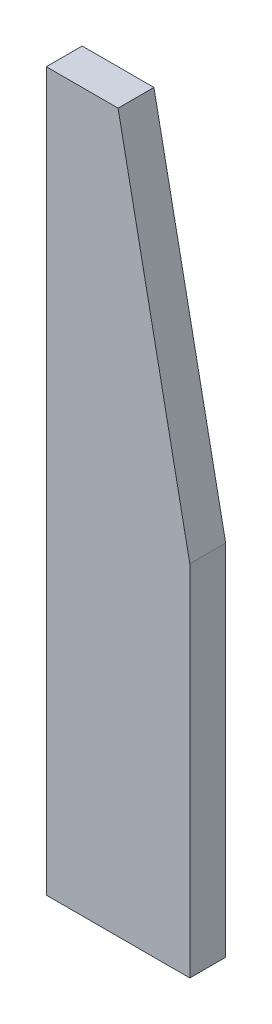
ISO-10303-21;
HEADER;
FILE_DESCRIPTION(('STEP AP214'),'2;1');
FILE_NAME('part.step','',(''),(''),'','','');
FILE_SCHEMA(('AUTOMOTIVE_DESIGN { 1 0 10303 214 1 1 1 1 }'));
ENDSEC;
DATA;
#1=APPLICATION_CONTEXT('core data for automotive mechanical design processes');
#2=APPLICATION_PROTOCOL_DEFINITION('international standard','automotive_design',2000,#1);
#3=PRODUCT_CONTEXT('',#1,'mechanical');
#4=PRODUCT('Part','Part','',(#3));
#5=PRODUCT_RELATED_PRODUCT_CATEGORY('part','',(#4));
#6=PRODUCT_DEFINITION_FORMATION('','',#4);
#7=PRODUCT_DEFINITION_CONTEXT('part definition',#1,'design');
#8=PRODUCT_DEFINITION('design','',#6,#7);
#9=PRODUCT_DEFINITION_SHAPE('','',#8);
#10=(LENGTH_UNIT() NAMED_UNIT(*) SI_UNIT(.MILLI.,.METRE.));
#11=(NAMED_UNIT(*) PLANE_ANGLE_UNIT() SI_UNIT($,.RADIAN.));
#12=(NAMED_UNIT(*) SI_UNIT($,.STERADIAN.) SOLID_ANGLE_UNIT());
#13=UNCERTAINTY_MEASURE_WITH_UNIT(LENGTH_MEASURE(1.E-05),#10,'distance_accuracy_value','');
#14=(GEOMETRIC_REPRESENTATION_CONTEXT(3) GLOBAL_UNCERTAINTY_ASSIGNED_CONTEXT((#13)) GLOBAL_UNIT_ASSIGNED_CONTEXT((#10,
#11,#12)) REPRESENTATION_CONTEXT('',''));
#15=CARTESIAN_POINT('',(0.,0.,0.));
#16=DIRECTION('',(0.,0.,1.));
#17=DIRECTION('',(1.,0.,0.));
#18=AXIS2_PLACEMENT_3D('',#15,#16,#17);
#19=CARTESIAN_POINT('',(25.4,-63.5,-3.175));
#20=DIRECTION('',(0.,0.,1.));
#21=DIRECTION('',(1.,0.,0.));
#22=AXIS2_PLACEMENT_3D('',#19,#20,#21);
#23=PLANE('',#22);
#24=DIRECTION('',(-1.,0.,0.));
#25=VECTOR('',#24,1.);
#26=CARTESIAN_POINT('',(25.4,63.5,-3.175));
#27=LINE('',#26,#25);
#28=CARTESIAN_POINT('',(12.7,63.5,-3.175));
#29=VERTEX_POINT('',#28);
#30=CARTESIAN_POINT('',(0.,63.5,-3.175));
#31=VERTEX_POINT('',#30);
#32=EDGE_CURVE('E11',#29,#31,#27,.T.);
#33=ORIENTED_EDGE('',*,*,#32,.F.);
#34=DIRECTION('',(0.196116135138184,-0.98058067569092,0.));
#35=VECTOR('',#34,1.);
#36=CARTESIAN_POINT('',(24.4230769230769,4.88461538461538,-3.175));
#37=LINE('',#36,#35);
#38=CARTESIAN_POINT('',(25.4,0.,-3.175));
#39=VERTEX_POINT('',#38);
#40=EDGE_CURVE('E143',#29,#39,#37,.T.);
#41=ORIENTED_EDGE('',*,*,#40,.T.);
#42=DIRECTION('',(0.,1.,0.));
#43=VECTOR('',#42,1.);
#44=CARTESIAN_POINT('',(25.4,-63.5,-3.175));
#45=LINE('',#44,#43);
#46=CARTESIAN_POINT('',(25.4,-63.5,-3.175));
#47=VERTEX_POINT('',#46);
#48=EDGE_CURVE('E100',#47,#39,#45,.T.);
#49=ORIENTED_EDGE('',*,*,#48,.F.);
#50=DIRECTION('',(-1.,0.,0.));
#51=VECTOR('',#50,1.);
#52=CARTESIAN_POINT('',(25.4,-63.5,-3.175));
#53=LINE('',#52,#51);
#54=CARTESIAN_POINT('',(0.,-63.5,-3.175));
#55=VERTEX_POINT('',#54);
#56=EDGE_CURVE('E93',#47,#55,#53,.T.);
#57=ORIENTED_EDGE('',*,*,#56,.T.);
#58=DIRECTION('',(0.,1.,0.));
#59=VECTOR('',#58,1.);
#60=CARTESIAN_POINT('',(0.,-63.5,-3.175));
#61=LINE('',#60,#59);
#62=EDGE_CURVE('E106',#55,#31,#61,.T.);
#63=ORIENTED_EDGE('',*,*,#62,.T.);
#64=EDGE_LOOP('',(#33,#41,#49,#57,#63));
#65=FACE_BOUND('',#64,.T.);
#66=ADVANCED_FACE('F44',(#65),#23,.F.);
#67=CARTESIAN_POINT('',(25.4,63.5,3.175));
#68=DIRECTION('',(0.,-1.,0.));
#69=DIRECTION('',(0.,0.,-1.));
#70=AXIS2_PLACEMENT_3D('',#67,#68,#69);
#71=PLANE('',#70);
#72=DIRECTION('',(-1.,0.,0.));
#73=VECTOR('',#72,1.);
#74=CARTESIAN_POINT('',(25.4,63.5,3.175));
#75=LINE('',#74,#73);
#76=CARTESIAN_POINT('',(12.7,63.5,3.175));
#77=VERTEX_POINT('',#76);
#78=CARTESIAN_POINT('',(0.,63.5,3.175));
#79=VERTEX_POINT('',#78);
#80=EDGE_CURVE('E54',#77,#79,#75,.T.);
#81=ORIENTED_EDGE('',*,*,#80,.F.);
#82=DIRECTION('',(0.,0.,1.));
#83=VECTOR('',#82,1.);
#84=CARTESIAN_POINT('',(12.7,63.5,-3.175));
#85=LINE('',#84,#83);
#86=EDGE_CURVE('E140',#29,#77,#85,.T.);
#87=ORIENTED_EDGE('',*,*,#86,.F.);
#88=ORIENTED_EDGE('',*,*,#32,.T.);
#89=DIRECTION('',(0.,0.,1.));
#90=VECTOR('',#89,1.);
#91=CARTESIAN_POINT('',(0.,63.5,3.175));
#92=LINE('',#91,#90);
#93=EDGE_CURVE('E112',#31,#79,#92,.T.);
#94=ORIENTED_EDGE('',*,*,#93,.T.);
#95=EDGE_LOOP('',(#81,#87,#88,#94));
#96=FACE_BOUND('',#95,.T.);
#97=ADVANCED_FACE('F138',(#96),#71,.F.);
#98=CARTESIAN_POINT('',(25.4,-63.5,3.175));
#99=DIRECTION('',(0.,0.,-1.));
#100=DIRECTION('',(-1.,0.,0.));
#101=AXIS2_PLACEMENT_3D('',#98,#99,#100);
#102=PLANE('',#101);
#103=DIRECTION('',(0.,-1.,0.));
#104=VECTOR('',#103,1.);
#105=CARTESIAN_POINT('',(25.4,-63.5,3.175));
#106=LINE('',#105,#104);
#107=CARTESIAN_POINT('',(25.4,0.,3.175));
#108=VERTEX_POINT('',#107);
#109=CARTESIAN_POINT('',(25.4,-63.5,3.175));
#110=VERTEX_POINT('',#109);
#111=EDGE_CURVE('E47',#108,#110,#106,.T.);
#112=ORIENTED_EDGE('',*,*,#111,.F.);
#113=DIRECTION('',(-0.196116135138184,0.98058067569092,0.));
#114=VECTOR('',#113,1.);
#115=CARTESIAN_POINT('',(37.6115384615385,-61.0576923076923,3.175));
#116=LINE('',#115,#114);
#117=EDGE_CURVE('E61',#108,#77,#116,.T.);
#118=ORIENTED_EDGE('',*,*,#117,.T.);
#119=ORIENTED_EDGE('',*,*,#80,.T.);
#120=DIRECTION('',(0.,-1.,0.));
#121=VECTOR('',#120,1.);
#122=CARTESIAN_POINT('',(0.,-63.5,3.175));
#123=LINE('',#122,#121);
#124=CARTESIAN_POINT('',(0.,-63.5,3.175));
#125=VERTEX_POINT('',#124);
#126=EDGE_CURVE('E101',#79,#125,#123,.T.);
#127=ORIENTED_EDGE('',*,*,#126,.T.);
#128=DIRECTION('',(-1.,0.,0.));
#129=VECTOR('',#128,1.);
#130=CARTESIAN_POINT('',(25.4,-63.5,3.175));
#131=LINE('',#130,#129);
#132=EDGE_CURVE('E96',#110,#125,#131,.T.);
#133=ORIENTED_EDGE('',*,*,#132,.F.);
#134=EDGE_LOOP('',(#112,#118,#119,#127,#133));
#135=FACE_BOUND('',#134,.T.);
#136=ADVANCED_FACE('F134',(#135),#102,.F.);
#137=CARTESIAN_POINT('',(25.4,-63.5,3.175));
#138=DIRECTION('',(0.,1.,0.));
#139=DIRECTION('',(0.,0.,1.));
#140=AXIS2_PLACEMENT_3D('',#137,#138,#139);
#141=PLANE('',#140);
#142=DIRECTION('',(0.,0.,-1.));
#143=VECTOR('',#142,1.);
#144=CARTESIAN_POINT('',(0.,-63.5,3.175));
#145=LINE('',#144,#143);
#146=EDGE_CURVE('E90',#125,#55,#145,.T.);
#147=ORIENTED_EDGE('',*,*,#146,.T.);
#148=ORIENTED_EDGE('',*,*,#56,.F.);
#149=DIRECTION('',(0.,0.,-1.));
#150=VECTOR('',#149,1.);
#151=CARTESIAN_POINT('',(25.4,-63.5,3.175));
#152=LINE('',#151,#150);
#153=EDGE_CURVE('E70',#110,#47,#152,.T.);
#154=ORIENTED_EDGE('',*,*,#153,.F.);
#155=ORIENTED_EDGE('',*,*,#132,.T.);
#156=EDGE_LOOP('',(#147,#148,#154,#155));
#157=FACE_BOUND('',#156,.T.);
#158=ADVANCED_FACE('F92',(#157),#141,.F.);
#159=CARTESIAN_POINT('',(25.4,0.,0.));
#160=DIRECTION('',(-1.,0.,0.));
#161=DIRECTION('',(0.,0.,1.));
#162=AXIS2_PLACEMENT_3D('',#159,#160,#161);
#163=PLANE('',#162);
#164=ORIENTED_EDGE('',*,*,#48,.T.);
#165=DIRECTION('',(0.,0.,1.));
#166=VECTOR('',#165,1.);
#167=CARTESIAN_POINT('',(25.4,0.,-3.175));
#168=LINE('',#167,#166);
#169=EDGE_CURVE('E188',#39,#108,#168,.T.);
#170=ORIENTED_EDGE('',*,*,#169,.T.);
#171=ORIENTED_EDGE('',*,*,#111,.T.);
#172=ORIENTED_EDGE('',*,*,#153,.T.);
#173=EDGE_LOOP('',(#164,#170,#171,#172));
#174=FACE_BOUND('',#173,.T.);
#175=ADVANCED_FACE('F187',(#174),#163,.F.);
#176=CARTESIAN_POINT('',(0.,0.,0.));
#177=DIRECTION('',(-1.,0.,0.));
#178=DIRECTION('',(0.,0.,1.));
#179=AXIS2_PLACEMENT_3D('',#176,#177,#178);
#180=PLANE('',#179);
#181=CARTESIAN_POINT('',(0.,53.5,0.));
#182=DIRECTION('',(-1.,0.,0.));
#183=DIRECTION('',(0.,0.,1.));
#184=AXIS2_PLACEMENT_3D('',#181,#182,#183);
#185=CIRCLE('',#184,1.02499999999999);
#186=CARTESIAN_POINT('',(0.,53.5,1.02499999999999));
#187=VERTEX_POINT('',#186);
#188=EDGE_CURVE('E191',#187,#187,#185,.T.);
#189=ORIENTED_EDGE('',*,*,#188,.F.);
#190=EDGE_LOOP('',(#189));
#191=FACE_BOUND('',#190,.T.);
#192=CARTESIAN_POINT('',(0.,26.75,0.));
#193=DIRECTION('',(-1.,0.,0.));
#194=DIRECTION('',(0.,0.,1.));
#195=AXIS2_PLACEMENT_3D('',#192,#193,#194);
#196=CIRCLE('',#195,1.02499999999999);
#197=CARTESIAN_POINT('',(0.,26.75,1.02499999999999));
#198=VERTEX_POINT('',#197);
#199=EDGE_CURVE('E206',#198,#198,#196,.T.);
#200=ORIENTED_EDGE('',*,*,#199,.F.);
#201=EDGE_LOOP('',(#200));
#202=FACE_BOUND('',#201,.T.);
#203=CARTESIAN_POINT('',(0.,0.,0.));
#204=DIRECTION('',(-1.,0.,0.));
#205=DIRECTION('',(0.,0.,1.));
#206=AXIS2_PLACEMENT_3D('',#203,#204,#205);
#207=CIRCLE('',#206,1.02499999999999);
#208=CARTESIAN_POINT('',(0.,0.,1.02499999999999));
#209=VERTEX_POINT('',#208);
#210=EDGE_CURVE('E213',#209,#209,#207,.T.);
#211=ORIENTED_EDGE('',*,*,#210,.F.);
#212=EDGE_LOOP('',(#211));
#213=FACE_BOUND('',#212,.T.);
#214=CARTESIAN_POINT('',(0.,-26.75,0.));
#215=DIRECTION('',(-1.,0.,0.));
#216=DIRECTION('',(0.,0.,1.));
#217=AXIS2_PLACEMENT_3D('',#214,#215,#216);
#218=CIRCLE('',#217,1.02499999999999);
#219=CARTESIAN_POINT('',(0.,-26.75,1.02499999999999));
#220=VERTEX_POINT('',#219);
#221=EDGE_CURVE('E182',#220,#220,#218,.T.);
#222=ORIENTED_EDGE('',*,*,#221,.F.);
#223=EDGE_LOOP('',(#222));
#224=FACE_BOUND('',#223,.T.);
#225=CARTESIAN_POINT('',(0.,-53.5,0.));
#226=DIRECTION('',(-1.,0.,0.));
#227=DIRECTION('',(0.,0.,1.));
#228=AXIS2_PLACEMENT_3D('',#225,#226,#227);
#229=CIRCLE('',#228,1.02499999999999);
#230=CARTESIAN_POINT('',(0.,-53.5,1.02499999999999));
#231=VERTEX_POINT('',#230);
#232=EDGE_CURVE('E121',#231,#231,#229,.T.);
#233=ORIENTED_EDGE('',*,*,#232,.F.);
#234=EDGE_LOOP('',(#233));
#235=FACE_BOUND('',#234,.T.);
#236=ORIENTED_EDGE('',*,*,#62,.F.);
#237=ORIENTED_EDGE('',*,*,#146,.F.);
#238=ORIENTED_EDGE('',*,*,#126,.F.);
#239=ORIENTED_EDGE('',*,*,#93,.F.);
#240=EDGE_LOOP('',(#236,#237,#238,#239));
#241=FACE_BOUND('',#240,.T.);
#242=ADVANCED_FACE('F110',(#191,#202,#213,#224,#235,#241),#180,.T.);
#243=CARTESIAN_POINT('',(6.34999999999999,-53.5,0.));
#244=DIRECTION('',(-1.,0.,0.));
#245=DIRECTION('',(0.,0.,1.));
#246=AXIS2_PLACEMENT_3D('',#243,#244,#245);
#247=CONICAL_SURFACE('',#246,1.02499999999998,1.02974425867664);
#248=CARTESIAN_POINT('',(6.96588213450325,-53.5,0.));
#249=VERTEX_POINT('',#248);
#250=VERTEX_LOOP('',#249);
#251=FACE_BOUND('',#250,.T.);
#252=CARTESIAN_POINT('',(6.34999999999999,-53.5,0.));
#253=DIRECTION('',(-1.,0.,0.));
#254=DIRECTION('',(0.,0.,1.));
#255=AXIS2_PLACEMENT_3D('',#252,#253,#254);
#256=CIRCLE('',#255,1.02499999999998);
#257=CARTESIAN_POINT('',(6.34999999999999,-53.5,1.02499999999998));
#258=VERTEX_POINT('',#257);
#259=EDGE_CURVE('E114',#258,#258,#256,.T.);
#260=ORIENTED_EDGE('',*,*,#259,.T.);
#261=EDGE_LOOP('',(#260));
#262=FACE_BOUND('',#261,.T.);
#263=ADVANCED_FACE('F165',(#251,#262),#247,.F.);
#264=CARTESIAN_POINT('',(0.,-53.5,0.));
#265=DIRECTION('',(-1.,0.,0.));
#266=DIRECTION('',(0.,0.,1.));
#267=AXIS2_PLACEMENT_3D('',#264,#265,#266);
#268=CYLINDRICAL_SURFACE('',#267,1.02499999999999);
#269=ORIENTED_EDGE('',*,*,#259,.F.);
#270=EDGE_LOOP('',(#269));
#271=FACE_BOUND('',#270,.T.);
#272=ORIENTED_EDGE('',*,*,#232,.T.);
#273=EDGE_LOOP('',(#272));
#274=FACE_BOUND('',#273,.T.);
#275=ADVANCED_FACE('F168',(#271,#274),#268,.F.);
#276=CARTESIAN_POINT('',(6.34999999999999,-26.75,0.));
#277=DIRECTION('',(-1.,0.,0.));
#278=DIRECTION('',(0.,0.,1.));
#279=AXIS2_PLACEMENT_3D('',#276,#277,#278);
#280=CONICAL_SURFACE('',#279,1.02499999999999,1.02974425867665);
#281=CARTESIAN_POINT('',(6.96588213450325,-26.75,0.));
#282=VERTEX_POINT('',#281);
#283=VERTEX_LOOP('',#282);
#284=FACE_BOUND('',#283,.T.);
#285=CARTESIAN_POINT('',(6.34999999999999,-26.75,0.));
#286=DIRECTION('',(-1.,0.,0.));
#287=DIRECTION('',(0.,0.,1.));
#288=AXIS2_PLACEMENT_3D('',#285,#286,#287);
#289=CIRCLE('',#288,1.02499999999999);
#290=CARTESIAN_POINT('',(6.34999999999999,-26.75,1.02499999999999));
#291=VERTEX_POINT('',#290);
#292=EDGE_CURVE('E179',#291,#291,#289,.T.);
#293=ORIENTED_EDGE('',*,*,#292,.T.);
#294=EDGE_LOOP('',(#293));
#295=FACE_BOUND('',#294,.T.);
#296=ADVANCED_FACE('F174',(#284,#295),#280,.F.);
#297=CARTESIAN_POINT('',(0.,-26.75,0.));
#298=DIRECTION('',(-1.,0.,0.));
#299=DIRECTION('',(0.,0.,1.));
#300=AXIS2_PLACEMENT_3D('',#297,#298,#299);
#301=CYLINDRICAL_SURFACE('',#300,1.02499999999999);
#302=ORIENTED_EDGE('',*,*,#292,.F.);
#303=EDGE_LOOP('',(#302));
#304=FACE_BOUND('',#303,.T.);
#305=ORIENTED_EDGE('',*,*,#221,.T.);
#306=EDGE_LOOP('',(#305));
#307=FACE_BOUND('',#306,.T.);
#308=ADVANCED_FACE('F221',(#304,#307),#301,.F.);
#309=CARTESIAN_POINT('',(6.34999999999999,0.,0.));
#310=DIRECTION('',(-1.,0.,0.));
#311=DIRECTION('',(0.,0.,1.));
#312=AXIS2_PLACEMENT_3D('',#309,#310,#311);
#313=CONICAL_SURFACE('',#312,1.02499999999999,1.02974425867665);
#314=CARTESIAN_POINT('',(6.96588213450325,0.,0.));
#315=VERTEX_POINT('',#314);
#316=VERTEX_LOOP('',#315);
#317=FACE_BOUND('',#316,.T.);
#318=CARTESIAN_POINT('',(6.34999999999999,0.,0.));
#319=DIRECTION('',(-1.,0.,0.));
#320=DIRECTION('',(0.,0.,1.));
#321=AXIS2_PLACEMENT_3D('',#318,#319,#320);
#322=CIRCLE('',#321,1.02499999999999);
#323=CARTESIAN_POINT('',(6.34999999999999,0.,1.02499999999999));
#324=VERTEX_POINT('',#323);
#325=EDGE_CURVE('E216',#324,#324,#322,.T.);
#326=ORIENTED_EDGE('',*,*,#325,.T.);
#327=EDGE_LOOP('',(#326));
#328=FACE_BOUND('',#327,.T.);
#329=ADVANCED_FACE('F309',(#317,#328),#313,.F.);
#330=CARTESIAN_POINT('',(0.,0.,0.));
#331=DIRECTION('',(-1.,0.,0.));
#332=DIRECTION('',(0.,0.,1.));
#333=AXIS2_PLACEMENT_3D('',#330,#331,#332);
#334=CYLINDRICAL_SURFACE('',#333,1.02499999999999);
#335=ORIENTED_EDGE('',*,*,#325,.F.);
#336=EDGE_LOOP('',(#335));
#337=FACE_BOUND('',#336,.T.);
#338=ORIENTED_EDGE('',*,*,#210,.T.);
#339=EDGE_LOOP('',(#338));
#340=FACE_BOUND('',#339,.T.);
#341=ADVANCED_FACE('F301',(#337,#340),#334,.F.);
#342=CARTESIAN_POINT('',(6.34999999999999,26.75,0.));
#343=DIRECTION('',(-1.,0.,0.));
#344=DIRECTION('',(0.,0.,1.));
#345=AXIS2_PLACEMENT_3D('',#342,#343,#344);
#346=CONICAL_SURFACE('',#345,1.02499999999999,1.02974425867665);
#347=CARTESIAN_POINT('',(6.96588213450325,26.75,0.));
#348=VERTEX_POINT('',#347);
#349=VERTEX_LOOP('',#348);
#350=FACE_BOUND('',#349,.T.);
#351=CARTESIAN_POINT('',(6.34999999999999,26.75,0.));
#352=DIRECTION('',(-1.,0.,0.));
#353=DIRECTION('',(0.,0.,1.));
#354=AXIS2_PLACEMENT_3D('',#351,#352,#353);
#355=CIRCLE('',#354,1.02499999999999);
#356=CARTESIAN_POINT('',(6.34999999999999,26.75,1.02499999999999));
#357=VERTEX_POINT('',#356);
#358=EDGE_CURVE('E209',#357,#357,#355,.T.);
#359=ORIENTED_EDGE('',*,*,#358,.T.);
#360=EDGE_LOOP('',(#359));
#361=FACE_BOUND('',#360,.T.);
#362=ADVANCED_FACE('F292',(#350,#361),#346,.F.);
#363=CARTESIAN_POINT('',(0.,26.75,0.));
#364=DIRECTION('',(-1.,0.,0.));
#365=DIRECTION('',(0.,0.,1.));
#366=AXIS2_PLACEMENT_3D('',#363,#364,#365);
#367=CYLINDRICAL_SURFACE('',#366,1.02499999999999);
#368=ORIENTED_EDGE('',*,*,#358,.F.);
#369=EDGE_LOOP('',(#368));
#370=FACE_BOUND('',#369,.T.);
#371=ORIENTED_EDGE('',*,*,#199,.T.);
#372=EDGE_LOOP('',(#371));
#373=FACE_BOUND('',#372,.T.);
#374=ADVANCED_FACE('F283',(#370,#373),#367,.F.);
#375=CARTESIAN_POINT('',(6.34999999999999,53.5,0.));
#376=DIRECTION('',(-1.,0.,0.));
#377=DIRECTION('',(0.,0.,1.));
#378=AXIS2_PLACEMENT_3D('',#375,#376,#377);
#379=CONICAL_SURFACE('',#378,1.02499999999998,1.02974425867664);
#380=CARTESIAN_POINT('',(6.96588213450325,53.5,0.));
#381=VERTEX_POINT('',#380);
#382=VERTEX_LOOP('',#381);
#383=FACE_BOUND('',#382,.T.);
#384=CARTESIAN_POINT('',(6.34999999999999,53.5,0.));
#385=DIRECTION('',(-1.,0.,0.));
#386=DIRECTION('',(0.,0.,1.));
#387=AXIS2_PLACEMENT_3D('',#384,#385,#386);
#388=CIRCLE('',#387,1.02499999999998);
#389=CARTESIAN_POINT('',(6.34999999999999,53.5,1.02499999999998));
#390=VERTEX_POINT('',#389);
#391=EDGE_CURVE('E202',#390,#390,#388,.T.);
#392=ORIENTED_EDGE('',*,*,#391,.T.);
#393=EDGE_LOOP('',(#392));
#394=FACE_BOUND('',#393,.T.);
#395=ADVANCED_FACE('F274',(#383,#394),#379,.F.);
#396=CARTESIAN_POINT('',(0.,53.5,0.));
#397=DIRECTION('',(-1.,0.,0.));
#398=DIRECTION('',(0.,0.,1.));
#399=AXIS2_PLACEMENT_3D('',#396,#397,#398);
#400=CYLINDRICAL_SURFACE('',#399,1.02499999999999);
#401=ORIENTED_EDGE('',*,*,#391,.F.);
#402=EDGE_LOOP('',(#401));
#403=FACE_BOUND('',#402,.T.);
#404=ORIENTED_EDGE('',*,*,#188,.T.);
#405=EDGE_LOOP('',(#404));
#406=FACE_BOUND('',#405,.T.);
#407=ADVANCED_FACE('F264',(#403,#406),#400,.F.);
#408=CARTESIAN_POINT('',(24.4230769230769,4.88461538461538,-3.175));
#409=DIRECTION('',(-0.98058067569092,-0.196116135138184,0.));
#410=DIRECTION('',(0.196116135138184,-0.98058067569092,0.));
#411=AXIS2_PLACEMENT_3D('',#408,#409,#410);
#412=PLANE('',#411);
#413=ORIENTED_EDGE('',*,*,#169,.F.);
#414=ORIENTED_EDGE('',*,*,#40,.F.);
#415=ORIENTED_EDGE('',*,*,#86,.T.);
#416=ORIENTED_EDGE('',*,*,#117,.F.);
#417=EDGE_LOOP('',(#413,#414,#415,#416));
#418=FACE_BOUND('',#417,.T.);
#419=ADVANCED_FACE('F260',(#418),#412,.F.);
#420=CLOSED_SHELL('',(#66,#97,#136,#158,#175,#242,#263,#275,#296,#308,#329,#341,#362,#374,#395,
#407,#419));
#421=MANIFOLD_SOLID_BREP('B2',#420);
#422=ADVANCED_BREP_SHAPE_REPRESENTATION('',(#18,#421),#14);
#423=SHAPE_DEFINITION_REPRESENTATION(#9,#422);
ENDSEC;
END-ISO-10303-21;
